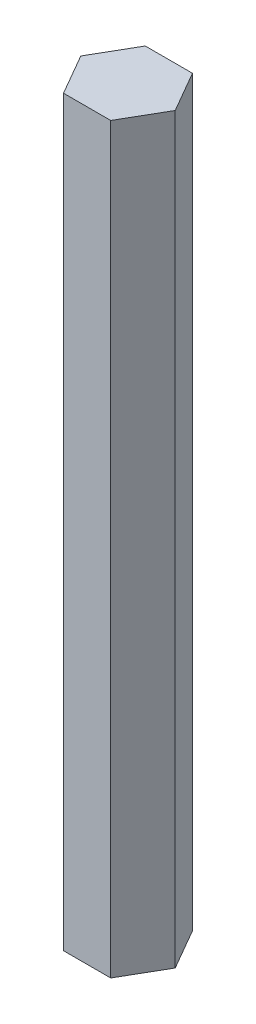
ISO-10303-21;
HEADER;
FILE_DESCRIPTION(('STEP AP214'),'2;1');
FILE_NAME('part.step','',(''),(''),'','','');
FILE_SCHEMA(('AUTOMOTIVE_DESIGN { 1 0 10303 214 1 1 1 1 }'));
ENDSEC;
DATA;
#1=APPLICATION_CONTEXT('core data for automotive mechanical design processes');
#2=APPLICATION_PROTOCOL_DEFINITION('international standard','automotive_design',2000,#1);
#3=PRODUCT_CONTEXT('',#1,'mechanical');
#4=PRODUCT('Part','Part','',(#3));
#5=PRODUCT_RELATED_PRODUCT_CATEGORY('part','',(#4));
#6=PRODUCT_DEFINITION_FORMATION('','',#4);
#7=PRODUCT_DEFINITION_CONTEXT('part definition',#1,'design');
#8=PRODUCT_DEFINITION('design','',#6,#7);
#9=PRODUCT_DEFINITION_SHAPE('','',#8);
#10=(LENGTH_UNIT() NAMED_UNIT(*) SI_UNIT(.MILLI.,.METRE.));
#11=(NAMED_UNIT(*) PLANE_ANGLE_UNIT() SI_UNIT($,.RADIAN.));
#12=(NAMED_UNIT(*) SI_UNIT($,.STERADIAN.) SOLID_ANGLE_UNIT());
#13=UNCERTAINTY_MEASURE_WITH_UNIT(LENGTH_MEASURE(1.E-05),#10,'distance_accuracy_value','');
#14=(GEOMETRIC_REPRESENTATION_CONTEXT(3) GLOBAL_UNCERTAINTY_ASSIGNED_CONTEXT((#13)) GLOBAL_UNIT_ASSIGNED_CONTEXT((#10,
#11,#12)) REPRESENTATION_CONTEXT('',''));
#15=CARTESIAN_POINT('',(0.,0.,0.));
#16=DIRECTION('',(0.,0.,1.));
#17=DIRECTION('',(1.,0.,0.));
#18=AXIS2_PLACEMENT_3D('',#15,#16,#17);
#19=CARTESIAN_POINT('',(-0.866025403784425,21.1325756949559,1.50000000000001));
#20=DIRECTION('',(0.,0.,-1.));
#21=DIRECTION('',(-1.,0.,0.));
#22=AXIS2_PLACEMENT_3D('',#19,#20,#21);
#23=PLANE('',#22);
#24=DIRECTION('',(0.,-1.,0.));
#25=VECTOR('',#24,1.);
#26=CARTESIAN_POINT('',(0.866025403784457,21.1325756949559,1.49999999999999));
#27=LINE('',#26,#25);
#28=CARTESIAN_POINT('',(0.866025403784457,16.55,1.49999999999999));
#29=VERTEX_POINT('',#28);
#30=CARTESIAN_POINT('',(0.866025403784457,-10.7020337829629,1.49999999999999));
#31=VERTEX_POINT('',#30);
#32=EDGE_CURVE('E109',#29,#31,#27,.T.);
#33=ORIENTED_EDGE('',*,*,#32,.F.);
#34=DIRECTION('',(-1.,0.,0.));
#35=VECTOR('',#34,1.);
#36=CARTESIAN_POINT('',(-0.866025403784425,16.55,1.50000000000001));
#37=LINE('',#36,#35);
#38=CARTESIAN_POINT('',(-0.866025403784425,16.55,1.50000000000001));
#39=VERTEX_POINT('',#38);
#40=EDGE_CURVE('E39',#29,#39,#37,.T.);
#41=ORIENTED_EDGE('',*,*,#40,.T.);
#42=DIRECTION('',(0.,-1.,0.));
#43=VECTOR('',#42,1.);
#44=CARTESIAN_POINT('',(-0.866025403784425,21.1325756949559,1.50000000000001));
#45=LINE('',#44,#43);
#46=CARTESIAN_POINT('',(-0.866025403784425,-10.7020337829629,1.50000000000001));
#47=VERTEX_POINT('',#46);
#48=EDGE_CURVE('E112',#39,#47,#45,.T.);
#49=ORIENTED_EDGE('',*,*,#48,.T.);
#50=DIRECTION('',(-1.,0.,0.));
#51=VECTOR('',#50,1.);
#52=CARTESIAN_POINT('',(-0.866025403784425,-10.7020337829629,1.50000000000001));
#53=LINE('',#52,#51);
#54=EDGE_CURVE('E114',#31,#47,#53,.T.);
#55=ORIENTED_EDGE('',*,*,#54,.F.);
#56=EDGE_LOOP('',(#33,#41,#49,#55));
#57=FACE_BOUND('',#56,.T.);
#58=ADVANCED_FACE('F35',(#57),#23,.F.);
#59=CARTESIAN_POINT('',(-1.73205080756888,21.1325756949559,0.));
#60=DIRECTION('',(0.866025403784435,0.,-0.500000000000007));
#61=DIRECTION('',(-0.500000000000007,0.,-0.866025403784434));
#62=AXIS2_PLACEMENT_3D('',#59,#60,#61);
#63=PLANE('',#62);
#64=ORIENTED_EDGE('',*,*,#48,.F.);
#65=DIRECTION('',(-0.500000000000007,0.,-0.866025403784434));
#66=VECTOR('',#65,1.);
#67=CARTESIAN_POINT('',(-1.73205080756888,16.55,0.));
#68=LINE('',#67,#66);
#69=CARTESIAN_POINT('',(-1.73205080756888,16.55,0.));
#70=VERTEX_POINT('',#69);
#71=EDGE_CURVE('E118',#39,#70,#68,.T.);
#72=ORIENTED_EDGE('',*,*,#71,.T.);
#73=DIRECTION('',(0.,-1.,0.));
#74=VECTOR('',#73,1.);
#75=CARTESIAN_POINT('',(-1.73205080756888,21.1325756949559,0.));
#76=LINE('',#75,#74);
#77=CARTESIAN_POINT('',(-1.73205080756888,-10.7020337829629,0.));
#78=VERTEX_POINT('',#77);
#79=EDGE_CURVE('E127',#70,#78,#76,.T.);
#80=ORIENTED_EDGE('',*,*,#79,.T.);
#81=DIRECTION('',(-0.500000000000007,0.,-0.866025403784435));
#82=VECTOR('',#81,1.);
#83=CARTESIAN_POINT('',(-1.73205080756888,-10.7020337829629,0.));
#84=LINE('',#83,#82);
#85=EDGE_CURVE('E138',#47,#78,#84,.T.);
#86=ORIENTED_EDGE('',*,*,#85,.F.);
#87=EDGE_LOOP('',(#64,#72,#80,#86));
#88=FACE_BOUND('',#87,.T.);
#89=ADVANCED_FACE('F145',(#88),#63,.F.);
#90=CARTESIAN_POINT('',(-0.866025403784446,21.1325756949559,-1.5));
#91=DIRECTION('',(0.866025403784442,0.,0.499999999999995));
#92=DIRECTION('',(0.499999999999995,0.,-0.866025403784442));
#93=AXIS2_PLACEMENT_3D('',#90,#91,#92);
#94=PLANE('',#93);
#95=ORIENTED_EDGE('',*,*,#79,.F.);
#96=DIRECTION('',(0.499999999999995,0.,-0.866025403784442));
#97=VECTOR('',#96,1.);
#98=CARTESIAN_POINT('',(-0.866025403784446,16.55,-1.5));
#99=LINE('',#98,#97);
#100=CARTESIAN_POINT('',(-0.866025403784446,16.55,-1.5));
#101=VERTEX_POINT('',#100);
#102=EDGE_CURVE('E121',#70,#101,#99,.T.);
#103=ORIENTED_EDGE('',*,*,#102,.T.);
#104=DIRECTION('',(0.,-1.,0.));
#105=VECTOR('',#104,1.);
#106=CARTESIAN_POINT('',(-0.866025403784446,21.1325756949559,-1.5));
#107=LINE('',#106,#105);
#108=CARTESIAN_POINT('',(-0.866025403784446,-10.7020337829629,-1.5));
#109=VERTEX_POINT('',#108);
#110=EDGE_CURVE('E94',#101,#109,#107,.T.);
#111=ORIENTED_EDGE('',*,*,#110,.T.);
#112=DIRECTION('',(0.499999999999995,0.,-0.866025403784442));
#113=VECTOR('',#112,1.);
#114=CARTESIAN_POINT('',(-0.866025403784446,-10.7020337829629,-1.5));
#115=LINE('',#114,#113);
#116=EDGE_CURVE('E105',#78,#109,#115,.T.);
#117=ORIENTED_EDGE('',*,*,#116,.F.);
#118=EDGE_LOOP('',(#95,#103,#111,#117));
#119=FACE_BOUND('',#118,.T.);
#120=ADVANCED_FACE('F144',(#119),#94,.F.);
#121=CARTESIAN_POINT('',(0.866025403784436,21.1325756949559,-1.5));
#122=DIRECTION('',(0.,0.,1.));
#123=DIRECTION('',(1.,0.,0.));
#124=AXIS2_PLACEMENT_3D('',#121,#122,#123);
#125=PLANE('',#124);
#126=ORIENTED_EDGE('',*,*,#110,.F.);
#127=DIRECTION('',(1.,0.,0.));
#128=VECTOR('',#127,1.);
#129=CARTESIAN_POINT('',(0.866025403784436,16.55,-1.5));
#130=LINE('',#129,#128);
#131=CARTESIAN_POINT('',(0.866025403784436,16.55,-1.5));
#132=VERTEX_POINT('',#131);
#133=EDGE_CURVE('E56',#101,#132,#130,.T.);
#134=ORIENTED_EDGE('',*,*,#133,.T.);
#135=DIRECTION('',(0.,-1.,0.));
#136=VECTOR('',#135,1.);
#137=CARTESIAN_POINT('',(0.866025403784436,21.1325756949559,-1.5));
#138=LINE('',#137,#136);
#139=CARTESIAN_POINT('',(0.866025403784436,-10.7020337829629,-1.5));
#140=VERTEX_POINT('',#139);
#141=EDGE_CURVE('E87',#132,#140,#138,.T.);
#142=ORIENTED_EDGE('',*,*,#141,.T.);
#143=DIRECTION('',(1.,0.,0.));
#144=VECTOR('',#143,1.);
#145=CARTESIAN_POINT('',(0.866025403784436,-10.7020337829629,-1.5));
#146=LINE('',#145,#144);
#147=EDGE_CURVE('E90',#109,#140,#146,.T.);
#148=ORIENTED_EDGE('',*,*,#147,.F.);
#149=EDGE_LOOP('',(#126,#134,#142,#148));
#150=FACE_BOUND('',#149,.T.);
#151=ADVANCED_FACE('F89',(#150),#125,.F.);
#152=CARTESIAN_POINT('',(1.73205080756888,21.1325756949559,0.));
#153=DIRECTION('',(-0.866025403784438,0.,0.500000000000001));
#154=DIRECTION('',(0.500000000000001,0.,0.866025403784438));
#155=AXIS2_PLACEMENT_3D('',#152,#153,#154);
#156=PLANE('',#155);
#157=ORIENTED_EDGE('',*,*,#141,.F.);
#158=DIRECTION('',(0.500000000000001,0.,0.866025403784438));
#159=VECTOR('',#158,1.);
#160=CARTESIAN_POINT('',(1.73205080756888,16.55,0.));
#161=LINE('',#160,#159);
#162=CARTESIAN_POINT('',(1.73205080756888,16.55,0.));
#163=VERTEX_POINT('',#162);
#164=EDGE_CURVE('E44',#132,#163,#161,.T.);
#165=ORIENTED_EDGE('',*,*,#164,.T.);
#166=DIRECTION('',(0.,-1.,0.));
#167=VECTOR('',#166,1.);
#168=CARTESIAN_POINT('',(1.73205080756888,21.1325756949559,0.));
#169=LINE('',#168,#167);
#170=CARTESIAN_POINT('',(1.73205080756888,-10.7020337829629,0.));
#171=VERTEX_POINT('',#170);
#172=EDGE_CURVE('E93',#163,#171,#169,.T.);
#173=ORIENTED_EDGE('',*,*,#172,.T.);
#174=DIRECTION('',(0.500000000000001,0.,0.866025403784438));
#175=VECTOR('',#174,1.);
#176=CARTESIAN_POINT('',(1.73205080756888,-10.7020337829629,0.));
#177=LINE('',#176,#175);
#178=EDGE_CURVE('E101',#140,#171,#177,.T.);
#179=ORIENTED_EDGE('',*,*,#178,.F.);
#180=EDGE_LOOP('',(#157,#165,#173,#179));
#181=FACE_BOUND('',#180,.T.);
#182=ADVANCED_FACE('F107',(#181),#156,.F.);
#183=CARTESIAN_POINT('',(0.866025403784457,21.1325756949559,1.49999999999999));
#184=DIRECTION('',(-0.866025403784442,0.,-0.499999999999995));
#185=DIRECTION('',(-0.499999999999995,0.,0.866025403784442));
#186=AXIS2_PLACEMENT_3D('',#183,#184,#185);
#187=PLANE('',#186);
#188=ORIENTED_EDGE('',*,*,#172,.F.);
#189=DIRECTION('',(-0.499999999999995,0.,0.866025403784442));
#190=VECTOR('',#189,1.);
#191=CARTESIAN_POINT('',(0.866025403784457,16.55,1.49999999999999));
#192=LINE('',#191,#190);
#193=EDGE_CURVE('E11',#163,#29,#192,.T.);
#194=ORIENTED_EDGE('',*,*,#193,.T.);
#195=ORIENTED_EDGE('',*,*,#32,.T.);
#196=DIRECTION('',(-0.499999999999995,0.,0.866025403784442));
#197=VECTOR('',#196,1.);
#198=CARTESIAN_POINT('',(0.866025403784457,-10.7020337829629,1.49999999999999));
#199=LINE('',#198,#197);
#200=EDGE_CURVE('E110',#171,#31,#199,.T.);
#201=ORIENTED_EDGE('',*,*,#200,.F.);
#202=EDGE_LOOP('',(#188,#194,#195,#201));
#203=FACE_BOUND('',#202,.T.);
#204=ADVANCED_FACE('F37',(#203),#187,.F.);
#205=CARTESIAN_POINT('',(0.,16.55,0.125000000000066));
#206=DIRECTION('',(0.,-1.,0.));
#207=DIRECTION('',(0.,0.,1.));
#208=AXIS2_PLACEMENT_3D('',#205,#206,#207);
#209=PLANE('',#208);
#210=ORIENTED_EDGE('',*,*,#164,.F.);
#211=ORIENTED_EDGE('',*,*,#133,.F.);
#212=ORIENTED_EDGE('',*,*,#102,.F.);
#213=ORIENTED_EDGE('',*,*,#71,.F.);
#214=ORIENTED_EDGE('',*,*,#40,.F.);
#215=ORIENTED_EDGE('',*,*,#193,.F.);
#216=EDGE_LOOP('',(#210,#211,#212,#213,#214,#215));
#217=FACE_BOUND('',#216,.T.);
#218=ADVANCED_FACE('F135',(#217),#209,.F.);
#219=CARTESIAN_POINT('',(2.28038339099978E-13,-10.7020337829629,0.125000000000163));
#220=DIRECTION('',(0.,1.,0.));
#221=DIRECTION('',(-0.000216580534876537,0.,0.999999976546436));
#222=AXIS2_PLACEMENT_3D('',#219,#220,#221);
#223=PLANE('',#222);
#224=ORIENTED_EDGE('',*,*,#200,.T.);
#225=ORIENTED_EDGE('',*,*,#54,.T.);
#226=ORIENTED_EDGE('',*,*,#85,.T.);
#227=ORIENTED_EDGE('',*,*,#116,.T.);
#228=ORIENTED_EDGE('',*,*,#147,.T.);
#229=ORIENTED_EDGE('',*,*,#178,.T.);
#230=EDGE_LOOP('',(#224,#225,#226,#227,#228,#229));
#231=FACE_BOUND('',#230,.T.);
#232=ADVANCED_FACE('F100',(#231),#223,.F.);
#233=CLOSED_SHELL('',(#58,#89,#120,#151,#182,#204,#218,#232));
#234=MANIFOLD_SOLID_BREP('B2',#233);
#235=ADVANCED_BREP_SHAPE_REPRESENTATION('',(#18,#234),#14);
#236=SHAPE_DEFINITION_REPRESENTATION(#9,#235);
ENDSEC;
END-ISO-10303-21;
